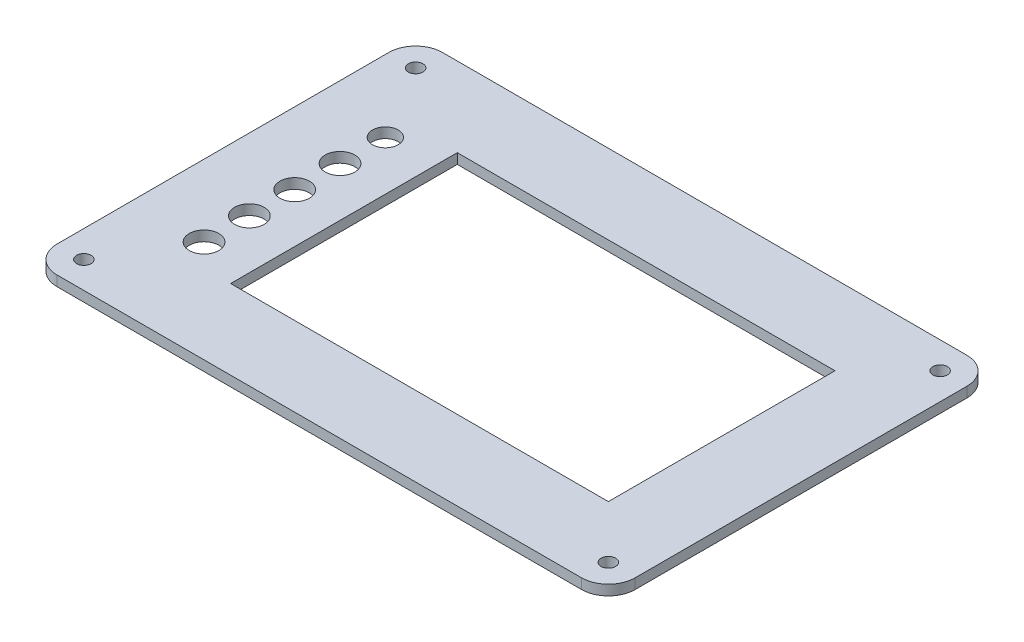
ISO-10303-21;
HEADER;
FILE_DESCRIPTION(('STEP AP214'),'2;1');
FILE_NAME('part.step','',(''),(''),'','','');
FILE_SCHEMA(('AUTOMOTIVE_DESIGN { 1 0 10303 214 1 1 1 1 }'));
ENDSEC;
DATA;
#1=APPLICATION_CONTEXT('core data for automotive mechanical design processes');
#2=APPLICATION_PROTOCOL_DEFINITION('international standard','automotive_design',2000,#1);
#3=PRODUCT_CONTEXT('',#1,'mechanical');
#4=PRODUCT('Part','Part','',(#3));
#5=PRODUCT_RELATED_PRODUCT_CATEGORY('part','',(#4));
#6=PRODUCT_DEFINITION_FORMATION('','',#4);
#7=PRODUCT_DEFINITION_CONTEXT('part definition',#1,'design');
#8=PRODUCT_DEFINITION('design','',#6,#7);
#9=PRODUCT_DEFINITION_SHAPE('','',#8);
#10=(LENGTH_UNIT() NAMED_UNIT(*) SI_UNIT(.MILLI.,.METRE.));
#11=(NAMED_UNIT(*) PLANE_ANGLE_UNIT() SI_UNIT($,.RADIAN.));
#12=(NAMED_UNIT(*) SI_UNIT($,.STERADIAN.) SOLID_ANGLE_UNIT());
#13=UNCERTAINTY_MEASURE_WITH_UNIT(LENGTH_MEASURE(1.E-05),#10,'distance_accuracy_value','');
#14=(GEOMETRIC_REPRESENTATION_CONTEXT(3) GLOBAL_UNCERTAINTY_ASSIGNED_CONTEXT((#13)) GLOBAL_UNIT_ASSIGNED_CONTEXT((#10,
#11,#12)) REPRESENTATION_CONTEXT('',''));
#15=CARTESIAN_POINT('',(0.,0.,0.));
#16=DIRECTION('',(0.,0.,1.));
#17=DIRECTION('',(1.,0.,0.));
#18=AXIS2_PLACEMENT_3D('',#15,#16,#17);
#19=CARTESIAN_POINT('',(-40.825,1.5875,-25.825));
#20=DIRECTION('',(0.,1.,0.));
#21=DIRECTION('',(0.,0.,1.));
#22=AXIS2_PLACEMENT_3D('',#19,#20,#21);
#23=PLANE('',#22);
#24=DIRECTION('',(0.,0.,-1.));
#25=VECTOR('',#24,1.);
#26=CARTESIAN_POINT('',(32.64,1.5875,-17.64));
#27=LINE('',#26,#25);
#28=CARTESIAN_POINT('',(32.64,1.5875,17.64));
#29=VERTEX_POINT('',#28);
#30=CARTESIAN_POINT('',(32.64,1.5875,-17.64));
#31=VERTEX_POINT('',#30);
#32=EDGE_CURVE('E48',#29,#31,#27,.T.);
#33=ORIENTED_EDGE('',*,*,#32,.F.);
#34=DIRECTION('',(1.,0.,0.));
#35=VECTOR('',#34,1.);
#36=CARTESIAN_POINT('',(-26.16,1.5875,17.64));
#37=LINE('',#36,#35);
#38=CARTESIAN_POINT('',(-26.16,1.5875,17.64));
#39=VERTEX_POINT('',#38);
#40=EDGE_CURVE('E140',#39,#29,#37,.T.);
#41=ORIENTED_EDGE('',*,*,#40,.F.);
#42=DIRECTION('',(0.,0.,1.));
#43=VECTOR('',#42,1.);
#44=CARTESIAN_POINT('',(-26.16,1.5875,-17.64));
#45=LINE('',#44,#43);
#46=CARTESIAN_POINT('',(-26.16,1.5875,-17.64));
#47=VERTEX_POINT('',#46);
#48=EDGE_CURVE('E143',#47,#39,#45,.T.);
#49=ORIENTED_EDGE('',*,*,#48,.F.);
#50=DIRECTION('',(-1.,0.,0.));
#51=VECTOR('',#50,1.);
#52=CARTESIAN_POINT('',(-26.16,1.5875,-17.64));
#53=LINE('',#52,#51);
#54=EDGE_CURVE('E149',#31,#47,#53,.T.);
#55=ORIENTED_EDGE('',*,*,#54,.F.);
#56=EDGE_LOOP('',(#33,#41,#49,#55));
#57=FACE_BOUND('',#56,.T.);
#58=CARTESIAN_POINT('',(-33.8249999999999,1.5875,14.115));
#59=DIRECTION('',(0.,1.,0.));
#60=DIRECTION('',(0.,0.,1.));
#61=AXIS2_PLACEMENT_3D('',#58,#59,#60);
#62=CIRCLE('',#61,2.30000000000001);
#63=CARTESIAN_POINT('',(-33.8249999999999,1.5875,16.415));
#64=VERTEX_POINT('',#63);
#65=EDGE_CURVE('E155',#64,#64,#62,.T.);
#66=ORIENTED_EDGE('',*,*,#65,.F.);
#67=EDGE_LOOP('',(#66));
#68=FACE_BOUND('',#67,.T.);
#69=CARTESIAN_POINT('',(-33.825,1.5875,7.059));
#70=DIRECTION('',(0.,1.,0.));
#71=DIRECTION('',(0.,0.,1.));
#72=AXIS2_PLACEMENT_3D('',#69,#70,#71);
#73=CIRCLE('',#72,2.30000000000001);
#74=CARTESIAN_POINT('',(-33.825,1.5875,9.35900000000001));
#75=VERTEX_POINT('',#74);
#76=EDGE_CURVE('E162',#75,#75,#73,.T.);
#77=ORIENTED_EDGE('',*,*,#76,.F.);
#78=EDGE_LOOP('',(#77));
#79=FACE_BOUND('',#78,.T.);
#80=CARTESIAN_POINT('',(-33.825,1.5875,0.00300000000000213));
#81=DIRECTION('',(0.,1.,0.));
#82=DIRECTION('',(0.,0.,1.));
#83=AXIS2_PLACEMENT_3D('',#80,#81,#82);
#84=CIRCLE('',#83,2.3);
#85=CARTESIAN_POINT('',(-33.825,1.5875,2.303));
#86=VERTEX_POINT('',#85);
#87=EDGE_CURVE('E168',#86,#86,#84,.T.);
#88=ORIENTED_EDGE('',*,*,#87,.F.);
#89=EDGE_LOOP('',(#88));
#90=FACE_BOUND('',#89,.T.);
#91=CARTESIAN_POINT('',(-33.825,1.5875,-7.053));
#92=DIRECTION('',(0.,1.,0.));
#93=DIRECTION('',(0.,0.,1.));
#94=AXIS2_PLACEMENT_3D('',#91,#92,#93);
#95=CIRCLE('',#94,2.3);
#96=CARTESIAN_POINT('',(-33.825,1.5875,-4.753));
#97=VERTEX_POINT('',#96);
#98=EDGE_CURVE('E174',#97,#97,#95,.T.);
#99=ORIENTED_EDGE('',*,*,#98,.F.);
#100=EDGE_LOOP('',(#99));
#101=FACE_BOUND('',#100,.T.);
#102=CARTESIAN_POINT('',(-33.825,1.5875,-14.109));
#103=DIRECTION('',(0.,1.,0.));
#104=DIRECTION('',(0.,0.,1.));
#105=AXIS2_PLACEMENT_3D('',#102,#103,#104);
#106=CIRCLE('',#105,1.9986);
#107=CARTESIAN_POINT('',(-33.825,1.5875,-12.1104));
#108=VERTEX_POINT('',#107);
#109=EDGE_CURVE('E180',#108,#108,#106,.T.);
#110=ORIENTED_EDGE('',*,*,#109,.F.);
#111=EDGE_LOOP('',(#110));
#112=FACE_BOUND('',#111,.T.);
#113=CARTESIAN_POINT('',(-40.825,1.5875,-25.825));
#114=DIRECTION('',(0.,1.,0.));
#115=DIRECTION('',(0.,0.,1.));
#116=AXIS2_PLACEMENT_3D('',#113,#114,#115);
#117=CIRCLE('',#116,1.1303);
#118=CARTESIAN_POINT('',(-40.825,1.5875,-24.6947));
#119=VERTEX_POINT('',#118);
#120=EDGE_CURVE('E195',#119,#119,#117,.T.);
#121=ORIENTED_EDGE('',*,*,#120,.F.);
#122=EDGE_LOOP('',(#121));
#123=FACE_BOUND('',#122,.T.);
#124=CARTESIAN_POINT('',(40.825,1.5875,-25.825));
#125=DIRECTION('',(0.,1.,0.));
#126=DIRECTION('',(0.,0.,1.));
#127=AXIS2_PLACEMENT_3D('',#124,#125,#126);
#128=CIRCLE('',#127,1.1303);
#129=CARTESIAN_POINT('',(40.825,1.5875,-24.6947));
#130=VERTEX_POINT('',#129);
#131=EDGE_CURVE('E207',#130,#130,#128,.T.);
#132=ORIENTED_EDGE('',*,*,#131,.F.);
#133=EDGE_LOOP('',(#132));
#134=FACE_BOUND('',#133,.T.);
#135=CARTESIAN_POINT('',(-40.825,1.5875,-25.825));
#136=DIRECTION('',(0.,1.,0.));
#137=DIRECTION('',(0.,0.,1.));
#138=AXIS2_PLACEMENT_3D('',#135,#136,#137);
#139=CIRCLE('',#138,4.17499999999999);
#140=CARTESIAN_POINT('',(-40.825,1.5875,-30.));
#141=VERTEX_POINT('',#140);
#142=CARTESIAN_POINT('',(-45.,1.5875,-25.825));
#143=VERTEX_POINT('',#142);
#144=EDGE_CURVE('E213',#141,#143,#139,.T.);
#145=ORIENTED_EDGE('',*,*,#144,.T.);
#146=DIRECTION('',(0.,0.,1.));
#147=VECTOR('',#146,1.);
#148=CARTESIAN_POINT('',(-45.,1.5875,-25.825));
#149=LINE('',#148,#147);
#150=CARTESIAN_POINT('',(-45.,1.5875,25.825));
#151=VERTEX_POINT('',#150);
#152=EDGE_CURVE('E216',#143,#151,#149,.T.);
#153=ORIENTED_EDGE('',*,*,#152,.T.);
#154=CARTESIAN_POINT('',(-40.825,1.5875,25.825));
#155=DIRECTION('',(0.,1.,0.));
#156=DIRECTION('',(0.,0.,1.));
#157=AXIS2_PLACEMENT_3D('',#154,#155,#156);
#158=CIRCLE('',#157,4.17500000000001);
#159=CARTESIAN_POINT('',(-40.825,1.5875,30.));
#160=VERTEX_POINT('',#159);
#161=EDGE_CURVE('E219',#151,#160,#158,.T.);
#162=ORIENTED_EDGE('',*,*,#161,.T.);
#163=DIRECTION('',(1.,0.,0.));
#164=VECTOR('',#163,1.);
#165=CARTESIAN_POINT('',(-40.825,1.5875,30.));
#166=LINE('',#165,#164);
#167=CARTESIAN_POINT('',(40.825,1.5875,30.));
#168=VERTEX_POINT('',#167);
#169=EDGE_CURVE('E221',#160,#168,#166,.T.);
#170=ORIENTED_EDGE('',*,*,#169,.T.);
#171=CARTESIAN_POINT('',(40.825,1.5875,25.825));
#172=DIRECTION('',(0.,1.,0.));
#173=DIRECTION('',(0.,0.,1.));
#174=AXIS2_PLACEMENT_3D('',#171,#172,#173);
#175=CIRCLE('',#174,4.17499999999999);
#176=CARTESIAN_POINT('',(45.,1.5875,25.825));
#177=VERTEX_POINT('',#176);
#178=EDGE_CURVE('E223',#168,#177,#175,.T.);
#179=ORIENTED_EDGE('',*,*,#178,.T.);
#180=DIRECTION('',(0.,0.,-1.));
#181=VECTOR('',#180,1.);
#182=CARTESIAN_POINT('',(45.,1.5875,-25.825));
#183=LINE('',#182,#181);
#184=CARTESIAN_POINT('',(45.,1.5875,-25.825));
#185=VERTEX_POINT('',#184);
#186=EDGE_CURVE('E225',#177,#185,#183,.T.);
#187=ORIENTED_EDGE('',*,*,#186,.T.);
#188=CARTESIAN_POINT('',(40.825,1.5875,-25.825));
#189=DIRECTION('',(0.,1.,0.));
#190=DIRECTION('',(0.,0.,1.));
#191=AXIS2_PLACEMENT_3D('',#188,#189,#190);
#192=CIRCLE('',#191,4.175);
#193=CARTESIAN_POINT('',(40.825,1.5875,-30.));
#194=VERTEX_POINT('',#193);
#195=EDGE_CURVE('E227',#185,#194,#192,.T.);
#196=ORIENTED_EDGE('',*,*,#195,.T.);
#197=DIRECTION('',(-1.,0.,0.));
#198=VECTOR('',#197,1.);
#199=CARTESIAN_POINT('',(-40.825,1.5875,-30.));
#200=LINE('',#199,#198);
#201=EDGE_CURVE('E229',#194,#141,#200,.T.);
#202=ORIENTED_EDGE('',*,*,#201,.T.);
#203=EDGE_LOOP('',(#145,#153,#162,#170,#179,#187,#196,#202));
#204=FACE_BOUND('',#203,.T.);
#205=CARTESIAN_POINT('',(40.825,1.5875,25.825));
#206=DIRECTION('',(0.,1.,0.));
#207=DIRECTION('',(0.,0.,1.));
#208=AXIS2_PLACEMENT_3D('',#205,#206,#207);
#209=CIRCLE('',#208,1.1303);
#210=CARTESIAN_POINT('',(40.825,1.5875,26.9553));
#211=VERTEX_POINT('',#210);
#212=EDGE_CURVE('E201',#211,#211,#209,.T.);
#213=ORIENTED_EDGE('',*,*,#212,.F.);
#214=EDGE_LOOP('',(#213));
#215=FACE_BOUND('',#214,.T.);
#216=CARTESIAN_POINT('',(-40.825,1.5875,25.825));
#217=DIRECTION('',(0.,1.,0.));
#218=DIRECTION('',(0.,0.,1.));
#219=AXIS2_PLACEMENT_3D('',#216,#217,#218);
#220=CIRCLE('',#219,1.1303);
#221=CARTESIAN_POINT('',(-40.825,1.5875,26.9553));
#222=VERTEX_POINT('',#221);
#223=EDGE_CURVE('E189',#222,#222,#220,.T.);
#224=ORIENTED_EDGE('',*,*,#223,.F.);
#225=EDGE_LOOP('',(#224));
#226=FACE_BOUND('',#225,.T.);
#227=ADVANCED_FACE('F33',(#57,#68,#79,#90,#101,#112,#123,#134,#204,#215,#226),#23,.T.);
#228=CARTESIAN_POINT('',(-40.825,0.,-25.825));
#229=DIRECTION('',(0.,1.,0.));
#230=DIRECTION('',(0.,0.,1.));
#231=AXIS2_PLACEMENT_3D('',#228,#229,#230);
#232=PLANE('',#231);
#233=DIRECTION('',(1.,0.,0.));
#234=VECTOR('',#233,1.);
#235=CARTESIAN_POINT('',(-26.16,0.,17.64));
#236=LINE('',#235,#234);
#237=CARTESIAN_POINT('',(-26.16,0.,17.64));
#238=VERTEX_POINT('',#237);
#239=CARTESIAN_POINT('',(32.64,0.,17.64));
#240=VERTEX_POINT('',#239);
#241=EDGE_CURVE('E130',#238,#240,#236,.T.);
#242=ORIENTED_EDGE('',*,*,#241,.T.);
#243=DIRECTION('',(0.,0.,-1.));
#244=VECTOR('',#243,1.);
#245=CARTESIAN_POINT('',(32.64,0.,-17.64));
#246=LINE('',#245,#244);
#247=CARTESIAN_POINT('',(32.64,0.,-17.64));
#248=VERTEX_POINT('',#247);
#249=EDGE_CURVE('E124',#240,#248,#246,.T.);
#250=ORIENTED_EDGE('',*,*,#249,.T.);
#251=DIRECTION('',(-1.,0.,0.));
#252=VECTOR('',#251,1.);
#253=CARTESIAN_POINT('',(-26.16,0.,-17.64));
#254=LINE('',#253,#252);
#255=CARTESIAN_POINT('',(-26.16,0.,-17.64));
#256=VERTEX_POINT('',#255);
#257=EDGE_CURVE('E133',#248,#256,#254,.T.);
#258=ORIENTED_EDGE('',*,*,#257,.T.);
#259=DIRECTION('',(0.,0.,1.));
#260=VECTOR('',#259,1.);
#261=CARTESIAN_POINT('',(-26.16,0.,-17.64));
#262=LINE('',#261,#260);
#263=EDGE_CURVE('E56',#256,#238,#262,.T.);
#264=ORIENTED_EDGE('',*,*,#263,.T.);
#265=EDGE_LOOP('',(#242,#250,#258,#264));
#266=FACE_BOUND('',#265,.T.);
#267=CARTESIAN_POINT('',(-33.8249999999999,0.,14.115));
#268=DIRECTION('',(0.,1.,0.));
#269=DIRECTION('',(0.,0.,1.));
#270=AXIS2_PLACEMENT_3D('',#267,#268,#269);
#271=CIRCLE('',#270,2.30000000000001);
#272=CARTESIAN_POINT('',(-33.8249999999999,0.,16.415));
#273=VERTEX_POINT('',#272);
#274=EDGE_CURVE('E159',#273,#273,#271,.T.);
#275=ORIENTED_EDGE('',*,*,#274,.T.);
#276=EDGE_LOOP('',(#275));
#277=FACE_BOUND('',#276,.T.);
#278=CARTESIAN_POINT('',(-33.825,0.,7.059));
#279=DIRECTION('',(0.,1.,0.));
#280=DIRECTION('',(0.,0.,1.));
#281=AXIS2_PLACEMENT_3D('',#278,#279,#280);
#282=CIRCLE('',#281,2.30000000000001);
#283=CARTESIAN_POINT('',(-33.825,0.,9.35900000000001));
#284=VERTEX_POINT('',#283);
#285=EDGE_CURVE('E165',#284,#284,#282,.T.);
#286=ORIENTED_EDGE('',*,*,#285,.T.);
#287=EDGE_LOOP('',(#286));
#288=FACE_BOUND('',#287,.T.);
#289=CARTESIAN_POINT('',(-33.825,0.,0.00300000000000213));
#290=DIRECTION('',(0.,1.,0.));
#291=DIRECTION('',(0.,0.,1.));
#292=AXIS2_PLACEMENT_3D('',#289,#290,#291);
#293=CIRCLE('',#292,2.3);
#294=CARTESIAN_POINT('',(-33.825,0.,2.303));
#295=VERTEX_POINT('',#294);
#296=EDGE_CURVE('E171',#295,#295,#293,.T.);
#297=ORIENTED_EDGE('',*,*,#296,.T.);
#298=EDGE_LOOP('',(#297));
#299=FACE_BOUND('',#298,.T.);
#300=CARTESIAN_POINT('',(-33.825,0.,-7.053));
#301=DIRECTION('',(0.,1.,0.));
#302=DIRECTION('',(0.,0.,1.));
#303=AXIS2_PLACEMENT_3D('',#300,#301,#302);
#304=CIRCLE('',#303,2.3);
#305=CARTESIAN_POINT('',(-33.825,0.,-4.753));
#306=VERTEX_POINT('',#305);
#307=EDGE_CURVE('E177',#306,#306,#304,.T.);
#308=ORIENTED_EDGE('',*,*,#307,.T.);
#309=EDGE_LOOP('',(#308));
#310=FACE_BOUND('',#309,.T.);
#311=CARTESIAN_POINT('',(-33.825,0.,-14.109));
#312=DIRECTION('',(0.,1.,0.));
#313=DIRECTION('',(0.,0.,1.));
#314=AXIS2_PLACEMENT_3D('',#311,#312,#313);
#315=CIRCLE('',#314,1.9986);
#316=CARTESIAN_POINT('',(-33.825,0.,-12.1104));
#317=VERTEX_POINT('',#316);
#318=EDGE_CURVE('E183',#317,#317,#315,.T.);
#319=ORIENTED_EDGE('',*,*,#318,.T.);
#320=EDGE_LOOP('',(#319));
#321=FACE_BOUND('',#320,.T.);
#322=CARTESIAN_POINT('',(-40.825,0.,-25.825));
#323=DIRECTION('',(0.,1.,0.));
#324=DIRECTION('',(0.,0.,1.));
#325=AXIS2_PLACEMENT_3D('',#322,#323,#324);
#326=CIRCLE('',#325,4.17499999999999);
#327=CARTESIAN_POINT('',(-40.825,0.,-30.));
#328=VERTEX_POINT('',#327);
#329=CARTESIAN_POINT('',(-45.,0.,-25.825));
#330=VERTEX_POINT('',#329);
#331=EDGE_CURVE('E210',#328,#330,#326,.T.);
#332=ORIENTED_EDGE('',*,*,#331,.F.);
#333=DIRECTION('',(-1.,0.,0.));
#334=VECTOR('',#333,1.);
#335=CARTESIAN_POINT('',(-40.825,0.,-30.));
#336=LINE('',#335,#334);
#337=CARTESIAN_POINT('',(40.825,0.,-30.));
#338=VERTEX_POINT('',#337);
#339=EDGE_CURVE('E217',#338,#328,#336,.T.);
#340=ORIENTED_EDGE('',*,*,#339,.F.);
#341=CARTESIAN_POINT('',(40.825,0.,-25.825));
#342=DIRECTION('',(0.,1.,0.));
#343=DIRECTION('',(0.,0.,1.));
#344=AXIS2_PLACEMENT_3D('',#341,#342,#343);
#345=CIRCLE('',#344,4.175);
#346=CARTESIAN_POINT('',(45.,0.,-25.825));
#347=VERTEX_POINT('',#346);
#348=EDGE_CURVE('E244',#347,#338,#345,.T.);
#349=ORIENTED_EDGE('',*,*,#348,.F.);
#350=DIRECTION('',(0.,0.,-1.));
#351=VECTOR('',#350,1.);
#352=CARTESIAN_POINT('',(45.,0.,-25.825));
#353=LINE('',#352,#351);
#354=CARTESIAN_POINT('',(45.,0.,25.825));
#355=VERTEX_POINT('',#354);
#356=EDGE_CURVE('E242',#355,#347,#353,.T.);
#357=ORIENTED_EDGE('',*,*,#356,.F.);
#358=CARTESIAN_POINT('',(40.825,0.,25.825));
#359=DIRECTION('',(0.,1.,0.));
#360=DIRECTION('',(0.,0.,1.));
#361=AXIS2_PLACEMENT_3D('',#358,#359,#360);
#362=CIRCLE('',#361,4.17499999999999);
#363=CARTESIAN_POINT('',(40.825,0.,30.));
#364=VERTEX_POINT('',#363);
#365=EDGE_CURVE('E240',#364,#355,#362,.T.);
#366=ORIENTED_EDGE('',*,*,#365,.F.);
#367=DIRECTION('',(1.,0.,0.));
#368=VECTOR('',#367,1.);
#369=CARTESIAN_POINT('',(-40.825,0.,30.));
#370=LINE('',#369,#368);
#371=CARTESIAN_POINT('',(-40.825,0.,30.));
#372=VERTEX_POINT('',#371);
#373=EDGE_CURVE('E238',#372,#364,#370,.T.);
#374=ORIENTED_EDGE('',*,*,#373,.F.);
#375=CARTESIAN_POINT('',(-40.825,0.,25.825));
#376=DIRECTION('',(0.,1.,0.));
#377=DIRECTION('',(0.,0.,1.));
#378=AXIS2_PLACEMENT_3D('',#375,#376,#377);
#379=CIRCLE('',#378,4.17500000000001);
#380=CARTESIAN_POINT('',(-45.,0.,25.825));
#381=VERTEX_POINT('',#380);
#382=EDGE_CURVE('E236',#381,#372,#379,.T.);
#383=ORIENTED_EDGE('',*,*,#382,.F.);
#384=DIRECTION('',(0.,0.,1.));
#385=VECTOR('',#384,1.);
#386=CARTESIAN_POINT('',(-45.,0.,-25.825));
#387=LINE('',#386,#385);
#388=EDGE_CURVE('E234',#330,#381,#387,.T.);
#389=ORIENTED_EDGE('',*,*,#388,.F.);
#390=EDGE_LOOP('',(#332,#340,#349,#357,#366,#374,#383,#389));
#391=FACE_BOUND('',#390,.T.);
#392=CARTESIAN_POINT('',(40.825,0.,-25.825));
#393=DIRECTION('',(0.,1.,0.));
#394=DIRECTION('',(0.,0.,1.));
#395=AXIS2_PLACEMENT_3D('',#392,#393,#394);
#396=CIRCLE('',#395,1.1303);
#397=CARTESIAN_POINT('',(40.825,0.,-24.6947));
#398=VERTEX_POINT('',#397);
#399=EDGE_CURVE('E204',#398,#398,#396,.T.);
#400=ORIENTED_EDGE('',*,*,#399,.T.);
#401=EDGE_LOOP('',(#400));
#402=FACE_BOUND('',#401,.T.);
#403=CARTESIAN_POINT('',(40.825,0.,25.825));
#404=DIRECTION('',(0.,1.,0.));
#405=DIRECTION('',(0.,0.,1.));
#406=AXIS2_PLACEMENT_3D('',#403,#404,#405);
#407=CIRCLE('',#406,1.1303);
#408=CARTESIAN_POINT('',(40.825,0.,26.9553));
#409=VERTEX_POINT('',#408);
#410=EDGE_CURVE('E198',#409,#409,#407,.T.);
#411=ORIENTED_EDGE('',*,*,#410,.T.);
#412=EDGE_LOOP('',(#411));
#413=FACE_BOUND('',#412,.T.);
#414=CARTESIAN_POINT('',(-40.825,0.,-25.825));
#415=DIRECTION('',(0.,1.,0.));
#416=DIRECTION('',(0.,0.,1.));
#417=AXIS2_PLACEMENT_3D('',#414,#415,#416);
#418=CIRCLE('',#417,1.1303);
#419=CARTESIAN_POINT('',(-40.825,0.,-24.6947));
#420=VERTEX_POINT('',#419);
#421=EDGE_CURVE('E192',#420,#420,#418,.T.);
#422=ORIENTED_EDGE('',*,*,#421,.T.);
#423=EDGE_LOOP('',(#422));
#424=FACE_BOUND('',#423,.T.);
#425=CARTESIAN_POINT('',(-40.825,0.,25.825));
#426=DIRECTION('',(0.,1.,0.));
#427=DIRECTION('',(0.,0.,1.));
#428=AXIS2_PLACEMENT_3D('',#425,#426,#427);
#429=CIRCLE('',#428,1.1303);
#430=CARTESIAN_POINT('',(-40.825,0.,26.9553));
#431=VERTEX_POINT('',#430);
#432=EDGE_CURVE('E186',#431,#431,#429,.T.);
#433=ORIENTED_EDGE('',*,*,#432,.T.);
#434=EDGE_LOOP('',(#433));
#435=FACE_BOUND('',#434,.T.);
#436=ADVANCED_FACE('F137',(#266,#277,#288,#299,#310,#321,#391,#402,#413,#424,#435),#232,.F.);
#437=CARTESIAN_POINT('',(-40.825,1.5875,-25.825));
#438=DIRECTION('',(0.,-1.,0.));
#439=DIRECTION('',(0.,0.,-1.));
#440=AXIS2_PLACEMENT_3D('',#437,#438,#439);
#441=CYLINDRICAL_SURFACE('',#440,4.17499999999999);
#442=ORIENTED_EDGE('',*,*,#331,.T.);
#443=DIRECTION('',(0.,-1.,0.));
#444=VECTOR('',#443,1.);
#445=CARTESIAN_POINT('',(-45.,1.5875,-25.825));
#446=LINE('',#445,#444);
#447=EDGE_CURVE('E11',#143,#330,#446,.T.);
#448=ORIENTED_EDGE('',*,*,#447,.F.);
#449=ORIENTED_EDGE('',*,*,#144,.F.);
#450=DIRECTION('',(0.,-1.,0.));
#451=VECTOR('',#450,1.);
#452=CARTESIAN_POINT('',(-40.825,1.5875,-30.));
#453=LINE('',#452,#451);
#454=EDGE_CURVE('E231',#141,#328,#453,.T.);
#455=ORIENTED_EDGE('',*,*,#454,.T.);
#456=EDGE_LOOP('',(#442,#448,#449,#455));
#457=FACE_BOUND('',#456,.T.);
#458=ADVANCED_FACE('F35',(#457),#441,.T.);
#459=CARTESIAN_POINT('',(-45.,1.5875,-25.825));
#460=DIRECTION('',(1.,0.,0.));
#461=DIRECTION('',(0.,0.,-1.));
#462=AXIS2_PLACEMENT_3D('',#459,#460,#461);
#463=PLANE('',#462);
#464=ORIENTED_EDGE('',*,*,#388,.T.);
#465=DIRECTION('',(0.,-1.,0.));
#466=VECTOR('',#465,1.);
#467=CARTESIAN_POINT('',(-45.,1.5875,25.825));
#468=LINE('',#467,#466);
#469=EDGE_CURVE('E41',#151,#381,#468,.T.);
#470=ORIENTED_EDGE('',*,*,#469,.F.);
#471=ORIENTED_EDGE('',*,*,#152,.F.);
#472=ORIENTED_EDGE('',*,*,#447,.T.);
#473=EDGE_LOOP('',(#464,#470,#471,#472));
#474=FACE_BOUND('',#473,.T.);
#475=ADVANCED_FACE('F291',(#474),#463,.F.);
#476=CARTESIAN_POINT('',(-40.825,1.5875,25.825));
#477=DIRECTION('',(0.,-1.,0.));
#478=DIRECTION('',(0.,0.,-1.));
#479=AXIS2_PLACEMENT_3D('',#476,#477,#478);
#480=CYLINDRICAL_SURFACE('',#479,4.17500000000001);
#481=ORIENTED_EDGE('',*,*,#382,.T.);
#482=DIRECTION('',(0.,-1.,0.));
#483=VECTOR('',#482,1.);
#484=CARTESIAN_POINT('',(-40.825,1.5875,30.));
#485=LINE('',#484,#483);
#486=EDGE_CURVE('E261',#160,#372,#485,.T.);
#487=ORIENTED_EDGE('',*,*,#486,.F.);
#488=ORIENTED_EDGE('',*,*,#161,.F.);
#489=ORIENTED_EDGE('',*,*,#469,.T.);
#490=EDGE_LOOP('',(#481,#487,#488,#489));
#491=FACE_BOUND('',#490,.T.);
#492=ADVANCED_FACE('F268',(#491),#480,.T.);
#493=CARTESIAN_POINT('',(-40.825,1.5875,30.));
#494=DIRECTION('',(0.,0.,-1.));
#495=DIRECTION('',(-1.,0.,0.));
#496=AXIS2_PLACEMENT_3D('',#493,#494,#495);
#497=PLANE('',#496);
#498=ORIENTED_EDGE('',*,*,#373,.T.);
#499=DIRECTION('',(0.,-1.,0.));
#500=VECTOR('',#499,1.);
#501=CARTESIAN_POINT('',(40.825,1.5875,30.));
#502=LINE('',#501,#500);
#503=EDGE_CURVE('E258',#168,#364,#502,.T.);
#504=ORIENTED_EDGE('',*,*,#503,.F.);
#505=ORIENTED_EDGE('',*,*,#169,.F.);
#506=ORIENTED_EDGE('',*,*,#486,.T.);
#507=EDGE_LOOP('',(#498,#504,#505,#506));
#508=FACE_BOUND('',#507,.T.);
#509=ADVANCED_FACE('F279',(#508),#497,.F.);
#510=CARTESIAN_POINT('',(40.825,1.5875,25.825));
#511=DIRECTION('',(0.,-1.,0.));
#512=DIRECTION('',(0.,0.,-1.));
#513=AXIS2_PLACEMENT_3D('',#510,#511,#512);
#514=CYLINDRICAL_SURFACE('',#513,4.17499999999999);
#515=ORIENTED_EDGE('',*,*,#365,.T.);
#516=DIRECTION('',(0.,-1.,0.));
#517=VECTOR('',#516,1.);
#518=CARTESIAN_POINT('',(45.,1.5875,25.825));
#519=LINE('',#518,#517);
#520=EDGE_CURVE('E255',#177,#355,#519,.T.);
#521=ORIENTED_EDGE('',*,*,#520,.F.);
#522=ORIENTED_EDGE('',*,*,#178,.F.);
#523=ORIENTED_EDGE('',*,*,#503,.T.);
#524=EDGE_LOOP('',(#515,#521,#522,#523));
#525=FACE_BOUND('',#524,.T.);
#526=ADVANCED_FACE('F283',(#525),#514,.T.);
#527=CARTESIAN_POINT('',(45.,1.5875,-25.825));
#528=DIRECTION('',(-1.,0.,0.));
#529=DIRECTION('',(0.,0.,1.));
#530=AXIS2_PLACEMENT_3D('',#527,#528,#529);
#531=PLANE('',#530);
#532=ORIENTED_EDGE('',*,*,#356,.T.);
#533=DIRECTION('',(0.,-1.,0.));
#534=VECTOR('',#533,1.);
#535=CARTESIAN_POINT('',(45.,1.5875,-25.825));
#536=LINE('',#535,#534);
#537=EDGE_CURVE('E252',#185,#347,#536,.T.);
#538=ORIENTED_EDGE('',*,*,#537,.F.);
#539=ORIENTED_EDGE('',*,*,#186,.F.);
#540=ORIENTED_EDGE('',*,*,#520,.T.);
#541=EDGE_LOOP('',(#532,#538,#539,#540));
#542=FACE_BOUND('',#541,.T.);
#543=ADVANCED_FACE('F304',(#542),#531,.F.);
#544=CARTESIAN_POINT('',(40.825,1.5875,-25.825));
#545=DIRECTION('',(0.,-1.,0.));
#546=DIRECTION('',(0.,0.,-1.));
#547=AXIS2_PLACEMENT_3D('',#544,#545,#546);
#548=CYLINDRICAL_SURFACE('',#547,4.175);
#549=ORIENTED_EDGE('',*,*,#348,.T.);
#550=DIRECTION('',(0.,-1.,0.));
#551=VECTOR('',#550,1.);
#552=CARTESIAN_POINT('',(40.825,1.5875,-30.));
#553=LINE('',#552,#551);
#554=EDGE_CURVE('E249',#194,#338,#553,.T.);
#555=ORIENTED_EDGE('',*,*,#554,.F.);
#556=ORIENTED_EDGE('',*,*,#195,.F.);
#557=ORIENTED_EDGE('',*,*,#537,.T.);
#558=EDGE_LOOP('',(#549,#555,#556,#557));
#559=FACE_BOUND('',#558,.T.);
#560=ADVANCED_FACE('F302',(#559),#548,.T.);
#561=CARTESIAN_POINT('',(-40.825,1.5875,-30.));
#562=DIRECTION('',(0.,0.,1.));
#563=DIRECTION('',(1.,0.,0.));
#564=AXIS2_PLACEMENT_3D('',#561,#562,#563);
#565=PLANE('',#564);
#566=ORIENTED_EDGE('',*,*,#339,.T.);
#567=ORIENTED_EDGE('',*,*,#454,.F.);
#568=ORIENTED_EDGE('',*,*,#201,.F.);
#569=ORIENTED_EDGE('',*,*,#554,.T.);
#570=EDGE_LOOP('',(#566,#567,#568,#569));
#571=FACE_BOUND('',#570,.T.);
#572=ADVANCED_FACE('F297',(#571),#565,.F.);
#573=CARTESIAN_POINT('',(40.825,1.5875,-25.825));
#574=DIRECTION('',(0.,-1.,0.));
#575=DIRECTION('',(0.,0.,-1.));
#576=AXIS2_PLACEMENT_3D('',#573,#574,#575);
#577=CYLINDRICAL_SURFACE('',#576,1.1303);
#578=ORIENTED_EDGE('',*,*,#131,.T.);
#579=EDGE_LOOP('',(#578));
#580=FACE_BOUND('',#579,.T.);
#581=ORIENTED_EDGE('',*,*,#399,.F.);
#582=EDGE_LOOP('',(#581));
#583=FACE_BOUND('',#582,.T.);
#584=ADVANCED_FACE('F322',(#580,#583),#577,.F.);
#585=CARTESIAN_POINT('',(40.825,1.5875,25.825));
#586=DIRECTION('',(0.,-1.,0.));
#587=DIRECTION('',(0.,0.,-1.));
#588=AXIS2_PLACEMENT_3D('',#585,#586,#587);
#589=CYLINDRICAL_SURFACE('',#588,1.1303);
#590=ORIENTED_EDGE('',*,*,#212,.T.);
#591=EDGE_LOOP('',(#590));
#592=FACE_BOUND('',#591,.T.);
#593=ORIENTED_EDGE('',*,*,#410,.F.);
#594=EDGE_LOOP('',(#593));
#595=FACE_BOUND('',#594,.T.);
#596=ADVANCED_FACE('F329',(#592,#595),#589,.F.);
#597=CARTESIAN_POINT('',(-40.825,1.5875,-25.825));
#598=DIRECTION('',(0.,-1.,0.));
#599=DIRECTION('',(0.,0.,-1.));
#600=AXIS2_PLACEMENT_3D('',#597,#598,#599);
#601=CYLINDRICAL_SURFACE('',#600,1.1303);
#602=ORIENTED_EDGE('',*,*,#120,.T.);
#603=EDGE_LOOP('',(#602));
#604=FACE_BOUND('',#603,.T.);
#605=ORIENTED_EDGE('',*,*,#421,.F.);
#606=EDGE_LOOP('',(#605));
#607=FACE_BOUND('',#606,.T.);
#608=ADVANCED_FACE('F334',(#604,#607),#601,.F.);
#609=CARTESIAN_POINT('',(-40.825,1.5875,25.825));
#610=DIRECTION('',(0.,-1.,0.));
#611=DIRECTION('',(0.,0.,-1.));
#612=AXIS2_PLACEMENT_3D('',#609,#610,#611);
#613=CYLINDRICAL_SURFACE('',#612,1.1303);
#614=ORIENTED_EDGE('',*,*,#223,.T.);
#615=EDGE_LOOP('',(#614));
#616=FACE_BOUND('',#615,.T.);
#617=ORIENTED_EDGE('',*,*,#432,.F.);
#618=EDGE_LOOP('',(#617));
#619=FACE_BOUND('',#618,.T.);
#620=ADVANCED_FACE('F346',(#616,#619),#613,.F.);
#621=CARTESIAN_POINT('',(-33.825,0.,-14.109));
#622=DIRECTION('',(0.,1.,0.));
#623=DIRECTION('',(0.,0.,1.));
#624=AXIS2_PLACEMENT_3D('',#621,#622,#623);
#625=CYLINDRICAL_SURFACE('',#624,1.9986);
#626=ORIENTED_EDGE('',*,*,#318,.F.);
#627=EDGE_LOOP('',(#626));
#628=FACE_BOUND('',#627,.T.);
#629=ORIENTED_EDGE('',*,*,#109,.T.);
#630=EDGE_LOOP('',(#629));
#631=FACE_BOUND('',#630,.T.);
#632=ADVANCED_FACE('F348',(#628,#631),#625,.F.);
#633=CARTESIAN_POINT('',(-33.825,0.,-7.053));
#634=DIRECTION('',(0.,1.,0.));
#635=DIRECTION('',(0.,0.,1.));
#636=AXIS2_PLACEMENT_3D('',#633,#634,#635);
#637=CYLINDRICAL_SURFACE('',#636,2.3);
#638=ORIENTED_EDGE('',*,*,#307,.F.);
#639=EDGE_LOOP('',(#638));
#640=FACE_BOUND('',#639,.T.);
#641=ORIENTED_EDGE('',*,*,#98,.T.);
#642=EDGE_LOOP('',(#641));
#643=FACE_BOUND('',#642,.T.);
#644=ADVANCED_FACE('F355',(#640,#643),#637,.F.);
#645=CARTESIAN_POINT('',(-33.825,0.,0.00300000000000213));
#646=DIRECTION('',(0.,1.,0.));
#647=DIRECTION('',(0.,0.,1.));
#648=AXIS2_PLACEMENT_3D('',#645,#646,#647);
#649=CYLINDRICAL_SURFACE('',#648,2.3);
#650=ORIENTED_EDGE('',*,*,#296,.F.);
#651=EDGE_LOOP('',(#650));
#652=FACE_BOUND('',#651,.T.);
#653=ORIENTED_EDGE('',*,*,#87,.T.);
#654=EDGE_LOOP('',(#653));
#655=FACE_BOUND('',#654,.T.);
#656=ADVANCED_FACE('F363',(#652,#655),#649,.F.);
#657=CARTESIAN_POINT('',(-33.825,0.,7.059));
#658=DIRECTION('',(0.,1.,0.));
#659=DIRECTION('',(0.,0.,1.));
#660=AXIS2_PLACEMENT_3D('',#657,#658,#659);
#661=CYLINDRICAL_SURFACE('',#660,2.30000000000001);
#662=ORIENTED_EDGE('',*,*,#285,.F.);
#663=EDGE_LOOP('',(#662));
#664=FACE_BOUND('',#663,.T.);
#665=ORIENTED_EDGE('',*,*,#76,.T.);
#666=EDGE_LOOP('',(#665));
#667=FACE_BOUND('',#666,.T.);
#668=ADVANCED_FACE('F367',(#664,#667),#661,.F.);
#669=CARTESIAN_POINT('',(-33.8249999999999,0.,14.115));
#670=DIRECTION('',(0.,1.,0.));
#671=DIRECTION('',(0.,0.,1.));
#672=AXIS2_PLACEMENT_3D('',#669,#670,#671);
#673=CYLINDRICAL_SURFACE('',#672,2.30000000000001);
#674=ORIENTED_EDGE('',*,*,#274,.F.);
#675=EDGE_LOOP('',(#674));
#676=FACE_BOUND('',#675,.T.);
#677=ORIENTED_EDGE('',*,*,#65,.T.);
#678=EDGE_LOOP('',(#677));
#679=FACE_BOUND('',#678,.T.);
#680=ADVANCED_FACE('F371',(#676,#679),#673,.F.);
#681=CARTESIAN_POINT('',(32.64,0.,-17.64));
#682=DIRECTION('',(1.,0.,0.));
#683=DIRECTION('',(0.,0.,-1.));
#684=AXIS2_PLACEMENT_3D('',#681,#682,#683);
#685=PLANE('',#684);
#686=ORIENTED_EDGE('',*,*,#32,.T.);
#687=DIRECTION('',(0.,1.,0.));
#688=VECTOR('',#687,1.);
#689=CARTESIAN_POINT('',(32.64,0.,-17.64));
#690=LINE('',#689,#688);
#691=EDGE_CURVE('E120',#248,#31,#690,.T.);
#692=ORIENTED_EDGE('',*,*,#691,.F.);
#693=ORIENTED_EDGE('',*,*,#249,.F.);
#694=DIRECTION('',(0.,1.,0.));
#695=VECTOR('',#694,1.);
#696=CARTESIAN_POINT('',(32.64,0.,17.64));
#697=LINE('',#696,#695);
#698=EDGE_CURVE('E153',#240,#29,#697,.T.);
#699=ORIENTED_EDGE('',*,*,#698,.T.);
#700=EDGE_LOOP('',(#686,#692,#693,#699));
#701=FACE_BOUND('',#700,.T.);
#702=ADVANCED_FACE('F122',(#701),#685,.F.);
#703=CARTESIAN_POINT('',(-26.16,0.,17.64));
#704=DIRECTION('',(0.,0.,1.));
#705=DIRECTION('',(1.,0.,0.));
#706=AXIS2_PLACEMENT_3D('',#703,#704,#705);
#707=PLANE('',#706);
#708=ORIENTED_EDGE('',*,*,#40,.T.);
#709=ORIENTED_EDGE('',*,*,#698,.F.);
#710=ORIENTED_EDGE('',*,*,#241,.F.);
#711=DIRECTION('',(0.,1.,0.));
#712=VECTOR('',#711,1.);
#713=CARTESIAN_POINT('',(-26.16,0.,17.64));
#714=LINE('',#713,#712);
#715=EDGE_CURVE('E156',#238,#39,#714,.T.);
#716=ORIENTED_EDGE('',*,*,#715,.T.);
#717=EDGE_LOOP('',(#708,#709,#710,#716));
#718=FACE_BOUND('',#717,.T.);
#719=ADVANCED_FACE('F378',(#718),#707,.F.);
#720=CARTESIAN_POINT('',(-26.16,0.,-17.64));
#721=DIRECTION('',(-1.,0.,0.));
#722=DIRECTION('',(0.,0.,1.));
#723=AXIS2_PLACEMENT_3D('',#720,#721,#722);
#724=PLANE('',#723);
#725=ORIENTED_EDGE('',*,*,#48,.T.);
#726=ORIENTED_EDGE('',*,*,#715,.F.);
#727=ORIENTED_EDGE('',*,*,#263,.F.);
#728=DIRECTION('',(0.,1.,0.));
#729=VECTOR('',#728,1.);
#730=CARTESIAN_POINT('',(-26.16,0.,-17.64));
#731=LINE('',#730,#729);
#732=EDGE_CURVE('E129',#256,#47,#731,.T.);
#733=ORIENTED_EDGE('',*,*,#732,.T.);
#734=EDGE_LOOP('',(#725,#726,#727,#733));
#735=FACE_BOUND('',#734,.T.);
#736=ADVANCED_FACE('F381',(#735),#724,.F.);
#737=CARTESIAN_POINT('',(-26.16,0.,-17.64));
#738=DIRECTION('',(0.,0.,-1.));
#739=DIRECTION('',(-1.,0.,0.));
#740=AXIS2_PLACEMENT_3D('',#737,#738,#739);
#741=PLANE('',#740);
#742=ORIENTED_EDGE('',*,*,#54,.T.);
#743=ORIENTED_EDGE('',*,*,#732,.F.);
#744=ORIENTED_EDGE('',*,*,#257,.F.);
#745=ORIENTED_EDGE('',*,*,#691,.T.);
#746=EDGE_LOOP('',(#742,#743,#744,#745));
#747=FACE_BOUND('',#746,.T.);
#748=ADVANCED_FACE('F134',(#747),#741,.F.);
#749=CLOSED_SHELL('',(#227,#436,#458,#475,#492,#509,#526,#543,#560,#572,#584,#596,#608,#620,
#632,#644,#656,#668,#680,#702,#719,#736,#748));
#750=MANIFOLD_SOLID_BREP('B2',#749);
#751=ADVANCED_BREP_SHAPE_REPRESENTATION('',(#18,#750),#14);
#752=SHAPE_DEFINITION_REPRESENTATION(#9,#751);
ENDSEC;
END-ISO-10303-21;
